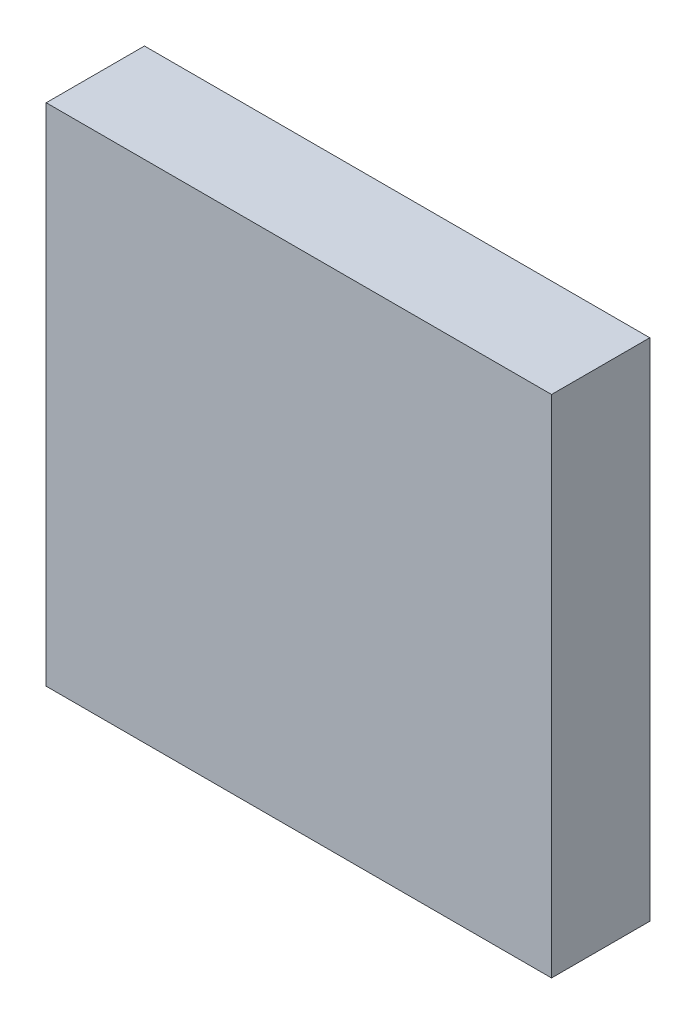
ISO-10303-21;
HEADER;
FILE_DESCRIPTION(('STEP AP214'),'2;1');
FILE_NAME('part.step','',(''),(''),'','','');
FILE_SCHEMA(('AUTOMOTIVE_DESIGN { 1 0 10303 214 1 1 1 1 }'));
ENDSEC;
DATA;
#1=APPLICATION_CONTEXT('core data for automotive mechanical design processes');
#2=APPLICATION_PROTOCOL_DEFINITION('international standard','automotive_design',2000,#1);
#3=PRODUCT_CONTEXT('',#1,'mechanical');
#4=PRODUCT('Part','Part','',(#3));
#5=PRODUCT_RELATED_PRODUCT_CATEGORY('part','',(#4));
#6=PRODUCT_DEFINITION_FORMATION('','',#4);
#7=PRODUCT_DEFINITION_CONTEXT('part definition',#1,'design');
#8=PRODUCT_DEFINITION('design','',#6,#7);
#9=PRODUCT_DEFINITION_SHAPE('','',#8);
#10=(LENGTH_UNIT() NAMED_UNIT(*) SI_UNIT(.MILLI.,.METRE.));
#11=(NAMED_UNIT(*) PLANE_ANGLE_UNIT() SI_UNIT($,.RADIAN.));
#12=(NAMED_UNIT(*) SI_UNIT($,.STERADIAN.) SOLID_ANGLE_UNIT());
#13=UNCERTAINTY_MEASURE_WITH_UNIT(LENGTH_MEASURE(1.E-05),#10,'distance_accuracy_value','');
#14=(GEOMETRIC_REPRESENTATION_CONTEXT(3) GLOBAL_UNCERTAINTY_ASSIGNED_CONTEXT((#13)) GLOBAL_UNIT_ASSIGNED_CONTEXT((#10,
#11,#12)) REPRESENTATION_CONTEXT('',''));
#15=CARTESIAN_POINT('',(0.,0.,0.));
#16=DIRECTION('',(0.,0.,1.));
#17=DIRECTION('',(1.,0.,0.));
#18=AXIS2_PLACEMENT_3D('',#15,#16,#17);
#19=CARTESIAN_POINT('',(0.,-18.,3.));
#20=DIRECTION('',(0.,1.,0.));
#21=DIRECTION('',(0.,0.,1.));
#22=AXIS2_PLACEMENT_3D('',#19,#20,#21);
#23=PLANE('',#22);
#24=DIRECTION('',(1.,0.,0.));
#25=VECTOR('',#24,1.);
#26=CARTESIAN_POINT('',(0.,-18.,-3.));
#27=LINE('',#26,#25);
#28=CARTESIAN_POINT('',(-18.,-18.,-3.));
#29=VERTEX_POINT('',#28);
#30=CARTESIAN_POINT('',(18.,-18.,-3.));
#31=VERTEX_POINT('',#30);
#32=EDGE_CURVE('E128',#29,#31,#27,.T.);
#33=ORIENTED_EDGE('',*,*,#32,.T.);
#34=DIRECTION('',(0.,0.,-1.));
#35=VECTOR('',#34,1.);
#36=CARTESIAN_POINT('',(18.,-18.,3.));
#37=LINE('',#36,#35);
#38=CARTESIAN_POINT('',(18.,-18.,4.));
#39=VERTEX_POINT('',#38);
#40=EDGE_CURVE('E49',#39,#31,#37,.T.);
#41=ORIENTED_EDGE('',*,*,#40,.F.);
#42=DIRECTION('',(-1.,0.,0.));
#43=VECTOR('',#42,1.);
#44=CARTESIAN_POINT('',(0.,-18.,4.));
#45=LINE('',#44,#43);
#46=CARTESIAN_POINT('',(-18.,-18.,4.));
#47=VERTEX_POINT('',#46);
#48=EDGE_CURVE('E98',#39,#47,#45,.T.);
#49=ORIENTED_EDGE('',*,*,#48,.T.);
#50=DIRECTION('',(0.,0.,-1.));
#51=VECTOR('',#50,1.);
#52=CARTESIAN_POINT('',(-18.,-18.,3.));
#53=LINE('',#52,#51);
#54=EDGE_CURVE('E62',#47,#29,#53,.T.);
#55=ORIENTED_EDGE('',*,*,#54,.T.);
#56=EDGE_LOOP('',(#33,#41,#49,#55));
#57=FACE_BOUND('',#56,.T.);
#58=ADVANCED_FACE('F45',(#57),#23,.F.);
#59=CARTESIAN_POINT('',(18.,0.,3.));
#60=DIRECTION('',(-1.,0.,0.));
#61=DIRECTION('',(0.,0.,1.));
#62=AXIS2_PLACEMENT_3D('',#59,#60,#61);
#63=PLANE('',#62);
#64=DIRECTION('',(0.,1.,0.));
#65=VECTOR('',#64,1.);
#66=CARTESIAN_POINT('',(18.,0.,-3.));
#67=LINE('',#66,#65);
#68=CARTESIAN_POINT('',(18.,17.9999999999999,-3.));
#69=VERTEX_POINT('',#68);
#70=EDGE_CURVE('E130',#31,#69,#67,.T.);
#71=ORIENTED_EDGE('',*,*,#70,.T.);
#72=DIRECTION('',(0.,0.,-1.));
#73=VECTOR('',#72,1.);
#74=CARTESIAN_POINT('',(18.,17.9999999999999,3.));
#75=LINE('',#74,#73);
#76=CARTESIAN_POINT('',(18.,17.9999999999999,4.));
#77=VERTEX_POINT('',#76);
#78=EDGE_CURVE('E137',#77,#69,#75,.T.);
#79=ORIENTED_EDGE('',*,*,#78,.F.);
#80=DIRECTION('',(0.,-1.,0.));
#81=VECTOR('',#80,1.);
#82=CARTESIAN_POINT('',(18.,0.,4.));
#83=LINE('',#82,#81);
#84=EDGE_CURVE('E103',#77,#39,#83,.T.);
#85=ORIENTED_EDGE('',*,*,#84,.T.);
#86=ORIENTED_EDGE('',*,*,#40,.T.);
#87=EDGE_LOOP('',(#71,#79,#85,#86));
#88=FACE_BOUND('',#87,.T.);
#89=ADVANCED_FACE('F141',(#88),#63,.F.);
#90=CARTESIAN_POINT('',(0.,17.9999999999999,3.));
#91=DIRECTION('',(0.,1.,0.));
#92=DIRECTION('',(0.,0.,1.));
#93=AXIS2_PLACEMENT_3D('',#90,#91,#92);
#94=PLANE('',#93);
#95=DIRECTION('',(1.,0.,0.));
#96=VECTOR('',#95,1.);
#97=CARTESIAN_POINT('',(0.,17.9999999999999,-3.));
#98=LINE('',#97,#96);
#99=CARTESIAN_POINT('',(-18.,17.9999999999999,-3.));
#100=VERTEX_POINT('',#99);
#101=EDGE_CURVE('E133',#100,#69,#98,.T.);
#102=ORIENTED_EDGE('',*,*,#101,.F.);
#103=DIRECTION('',(0.,0.,-1.));
#104=VECTOR('',#103,1.);
#105=CARTESIAN_POINT('',(-18.,17.9999999999999,3.));
#106=LINE('',#105,#104);
#107=CARTESIAN_POINT('',(-18.,17.9999999999999,4.));
#108=VERTEX_POINT('',#107);
#109=EDGE_CURVE('E70',#108,#100,#106,.T.);
#110=ORIENTED_EDGE('',*,*,#109,.F.);
#111=DIRECTION('',(-1.,0.,0.));
#112=VECTOR('',#111,1.);
#113=CARTESIAN_POINT('',(0.,17.9999999999999,4.));
#114=LINE('',#113,#112);
#115=EDGE_CURVE('E101',#77,#108,#114,.T.);
#116=ORIENTED_EDGE('',*,*,#115,.F.);
#117=ORIENTED_EDGE('',*,*,#78,.T.);
#118=EDGE_LOOP('',(#102,#110,#116,#117));
#119=FACE_BOUND('',#118,.T.);
#120=ADVANCED_FACE('F144',(#119),#94,.T.);
#121=CARTESIAN_POINT('',(15.5,-15.5,3.));
#122=DIRECTION('',(0.,0.,-1.));
#123=DIRECTION('',(-1.,0.,0.));
#124=AXIS2_PLACEMENT_3D('',#121,#122,#123);
#125=CYLINDRICAL_SURFACE('',#124,2.15);
#126=CARTESIAN_POINT('',(15.5,-15.5,2.));
#127=DIRECTION('',(0.,0.,-1.));
#128=DIRECTION('',(-1.,0.,0.));
#129=AXIS2_PLACEMENT_3D('',#126,#127,#128);
#130=CIRCLE('',#129,2.15);
#131=CARTESIAN_POINT('',(13.35,-15.5,2.));
#132=VERTEX_POINT('',#131);
#133=EDGE_CURVE('E11',#132,#132,#130,.T.);
#134=ORIENTED_EDGE('',*,*,#133,.F.);
#135=EDGE_LOOP('',(#134));
#136=FACE_BOUND('',#135,.T.);
#137=CARTESIAN_POINT('',(15.5,-15.5,-3.));
#138=DIRECTION('',(0.,0.,1.));
#139=DIRECTION('',(1.,0.,0.));
#140=AXIS2_PLACEMENT_3D('',#137,#138,#139);
#141=CIRCLE('',#140,2.15);
#142=CARTESIAN_POINT('',(17.65,-15.5,-3.));
#143=VERTEX_POINT('',#142);
#144=EDGE_CURVE('E125',#143,#143,#141,.T.);
#145=ORIENTED_EDGE('',*,*,#144,.F.);
#146=EDGE_LOOP('',(#145));
#147=FACE_BOUND('',#146,.T.);
#148=ADVANCED_FACE('F146',(#136,#147),#125,.F.);
#149=CARTESIAN_POINT('',(-15.5,-15.5,3.));
#150=DIRECTION('',(0.,0.,-1.));
#151=DIRECTION('',(-1.,0.,0.));
#152=AXIS2_PLACEMENT_3D('',#149,#150,#151);
#153=CYLINDRICAL_SURFACE('',#152,2.15);
#154=CARTESIAN_POINT('',(-15.5,-15.5,2.));
#155=DIRECTION('',(0.,0.,-1.));
#156=DIRECTION('',(-1.,0.,0.));
#157=AXIS2_PLACEMENT_3D('',#154,#155,#156);
#158=CIRCLE('',#157,2.15);
#159=CARTESIAN_POINT('',(-17.65,-15.5,2.));
#160=VERTEX_POINT('',#159);
#161=EDGE_CURVE('E54',#160,#160,#158,.T.);
#162=ORIENTED_EDGE('',*,*,#161,.F.);
#163=EDGE_LOOP('',(#162));
#164=FACE_BOUND('',#163,.T.);
#165=CARTESIAN_POINT('',(-15.5,-15.5,-3.));
#166=DIRECTION('',(0.,0.,1.));
#167=DIRECTION('',(1.,0.,0.));
#168=AXIS2_PLACEMENT_3D('',#165,#166,#167);
#169=CIRCLE('',#168,2.15);
#170=CARTESIAN_POINT('',(-13.35,-15.5,-3.));
#171=VERTEX_POINT('',#170);
#172=EDGE_CURVE('E122',#171,#171,#169,.T.);
#173=ORIENTED_EDGE('',*,*,#172,.F.);
#174=EDGE_LOOP('',(#173));
#175=FACE_BOUND('',#174,.T.);
#176=ADVANCED_FACE('F152',(#164,#175),#153,.F.);
#177=CARTESIAN_POINT('',(15.5,15.5,3.));
#178=DIRECTION('',(0.,0.,-1.));
#179=DIRECTION('',(-1.,0.,0.));
#180=AXIS2_PLACEMENT_3D('',#177,#178,#179);
#181=CYLINDRICAL_SURFACE('',#180,2.15);
#182=CARTESIAN_POINT('',(15.5,15.5,2.));
#183=DIRECTION('',(0.,0.,-1.));
#184=DIRECTION('',(-1.,0.,0.));
#185=AXIS2_PLACEMENT_3D('',#182,#183,#184);
#186=CIRCLE('',#185,2.15);
#187=CARTESIAN_POINT('',(13.35,15.5,2.));
#188=VERTEX_POINT('',#187);
#189=EDGE_CURVE('E112',#188,#188,#186,.T.);
#190=ORIENTED_EDGE('',*,*,#189,.F.);
#191=EDGE_LOOP('',(#190));
#192=FACE_BOUND('',#191,.T.);
#193=CARTESIAN_POINT('',(15.5,15.5,-3.));
#194=DIRECTION('',(0.,0.,1.));
#195=DIRECTION('',(1.,0.,0.));
#196=AXIS2_PLACEMENT_3D('',#193,#194,#195);
#197=CIRCLE('',#196,2.15);
#198=CARTESIAN_POINT('',(17.65,15.5,-3.));
#199=VERTEX_POINT('',#198);
#200=EDGE_CURVE('E119',#199,#199,#197,.T.);
#201=ORIENTED_EDGE('',*,*,#200,.F.);
#202=EDGE_LOOP('',(#201));
#203=FACE_BOUND('',#202,.T.);
#204=ADVANCED_FACE('F164',(#192,#203),#181,.F.);
#205=CARTESIAN_POINT('',(-15.5,15.5,3.));
#206=DIRECTION('',(0.,0.,-1.));
#207=DIRECTION('',(-1.,0.,0.));
#208=AXIS2_PLACEMENT_3D('',#205,#206,#207);
#209=CYLINDRICAL_SURFACE('',#208,2.15);
#210=CARTESIAN_POINT('',(-15.5,15.5,2.));
#211=DIRECTION('',(0.,0.,-1.));
#212=DIRECTION('',(-1.,0.,0.));
#213=AXIS2_PLACEMENT_3D('',#210,#211,#212);
#214=CIRCLE('',#213,2.15);
#215=CARTESIAN_POINT('',(-17.65,15.5,2.));
#216=VERTEX_POINT('',#215);
#217=EDGE_CURVE('E109',#216,#216,#214,.T.);
#218=ORIENTED_EDGE('',*,*,#217,.F.);
#219=EDGE_LOOP('',(#218));
#220=FACE_BOUND('',#219,.T.);
#221=CARTESIAN_POINT('',(-15.5,15.5,-3.));
#222=DIRECTION('',(0.,0.,1.));
#223=DIRECTION('',(1.,0.,0.));
#224=AXIS2_PLACEMENT_3D('',#221,#222,#223);
#225=CIRCLE('',#224,2.15);
#226=CARTESIAN_POINT('',(-13.35,15.5,-3.));
#227=VERTEX_POINT('',#226);
#228=EDGE_CURVE('E108',#227,#227,#225,.T.);
#229=ORIENTED_EDGE('',*,*,#228,.F.);
#230=EDGE_LOOP('',(#229));
#231=FACE_BOUND('',#230,.T.);
#232=ADVANCED_FACE('F47',(#220,#231),#209,.F.);
#233=CARTESIAN_POINT('',(-18.,0.,3.));
#234=DIRECTION('',(-1.,0.,0.));
#235=DIRECTION('',(0.,0.,1.));
#236=AXIS2_PLACEMENT_3D('',#233,#234,#235);
#237=PLANE('',#236);
#238=DIRECTION('',(0.,1.,0.));
#239=VECTOR('',#238,1.);
#240=CARTESIAN_POINT('',(-18.,0.,-3.));
#241=LINE('',#240,#239);
#242=EDGE_CURVE('E91',#29,#100,#241,.T.);
#243=ORIENTED_EDGE('',*,*,#242,.F.);
#244=ORIENTED_EDGE('',*,*,#54,.F.);
#245=DIRECTION('',(0.,-1.,0.));
#246=VECTOR('',#245,1.);
#247=CARTESIAN_POINT('',(-18.,0.,4.));
#248=LINE('',#247,#246);
#249=EDGE_CURVE('E89',#108,#47,#248,.T.);
#250=ORIENTED_EDGE('',*,*,#249,.F.);
#251=ORIENTED_EDGE('',*,*,#109,.T.);
#252=EDGE_LOOP('',(#243,#244,#250,#251));
#253=FACE_BOUND('',#252,.T.);
#254=ADVANCED_FACE('F88',(#253),#237,.T.);
#255=CARTESIAN_POINT('',(0.,0.,-3.));
#256=DIRECTION('',(0.,0.,1.));
#257=DIRECTION('',(1.,0.,0.));
#258=AXIS2_PLACEMENT_3D('',#255,#256,#257);
#259=PLANE('',#258);
#260=ORIENTED_EDGE('',*,*,#228,.T.);
#261=EDGE_LOOP('',(#260));
#262=FACE_BOUND('',#261,.T.);
#263=ORIENTED_EDGE('',*,*,#200,.T.);
#264=EDGE_LOOP('',(#263));
#265=FACE_BOUND('',#264,.T.);
#266=ORIENTED_EDGE('',*,*,#172,.T.);
#267=EDGE_LOOP('',(#266));
#268=FACE_BOUND('',#267,.T.);
#269=ORIENTED_EDGE('',*,*,#144,.T.);
#270=EDGE_LOOP('',(#269));
#271=FACE_BOUND('',#270,.T.);
#272=ORIENTED_EDGE('',*,*,#32,.F.);
#273=ORIENTED_EDGE('',*,*,#242,.T.);
#274=ORIENTED_EDGE('',*,*,#101,.T.);
#275=ORIENTED_EDGE('',*,*,#70,.F.);
#276=EDGE_LOOP('',(#272,#273,#274,#275));
#277=FACE_BOUND('',#276,.T.);
#278=ADVANCED_FACE('F143',(#262,#265,#268,#271,#277),#259,.F.);
#279=CARTESIAN_POINT('',(0.,0.,4.));
#280=DIRECTION('',(0.,0.,-1.));
#281=DIRECTION('',(-1.,0.,0.));
#282=AXIS2_PLACEMENT_3D('',#279,#280,#281);
#283=PLANE('',#282);
#284=ORIENTED_EDGE('',*,*,#249,.T.);
#285=ORIENTED_EDGE('',*,*,#48,.F.);
#286=ORIENTED_EDGE('',*,*,#84,.F.);
#287=ORIENTED_EDGE('',*,*,#115,.T.);
#288=EDGE_LOOP('',(#284,#285,#286,#287));
#289=FACE_BOUND('',#288,.T.);
#290=ADVANCED_FACE('F96',(#289),#283,.F.);
#291=CARTESIAN_POINT('',(0.,0.,2.));
#292=DIRECTION('',(0.,0.,-1.));
#293=DIRECTION('',(-1.,0.,0.));
#294=AXIS2_PLACEMENT_3D('',#291,#292,#293);
#295=PLANE('',#294);
#296=ORIENTED_EDGE('',*,*,#217,.T.);
#297=EDGE_LOOP('',(#296));
#298=FACE_BOUND('',#297,.T.);
#299=ADVANCED_FACE('F187',(#298),#295,.T.);
#300=ORIENTED_EDGE('',*,*,#189,.T.);
#301=EDGE_LOOP('',(#300));
#302=FACE_BOUND('',#301,.T.);
#303=ADVANCED_FACE('F192',(#302),#295,.T.);
#304=ORIENTED_EDGE('',*,*,#161,.T.);
#305=EDGE_LOOP('',(#304));
#306=FACE_BOUND('',#305,.T.);
#307=ADVANCED_FACE('F198',(#306),#295,.T.);
#308=ORIENTED_EDGE('',*,*,#133,.T.);
#309=EDGE_LOOP('',(#308));
#310=FACE_BOUND('',#309,.T.);
#311=ADVANCED_FACE('F194',(#310),#295,.T.);
#312=CLOSED_SHELL('',(#58,#89,#120,#148,#176,#204,#232,#254,#278,#290,#299,#303,#307,#311));
#313=MANIFOLD_SOLID_BREP('B2',#312);
#314=ADVANCED_BREP_SHAPE_REPRESENTATION('',(#18,#313),#14);
#315=SHAPE_DEFINITION_REPRESENTATION(#9,#314);
ENDSEC;
END-ISO-10303-21;
